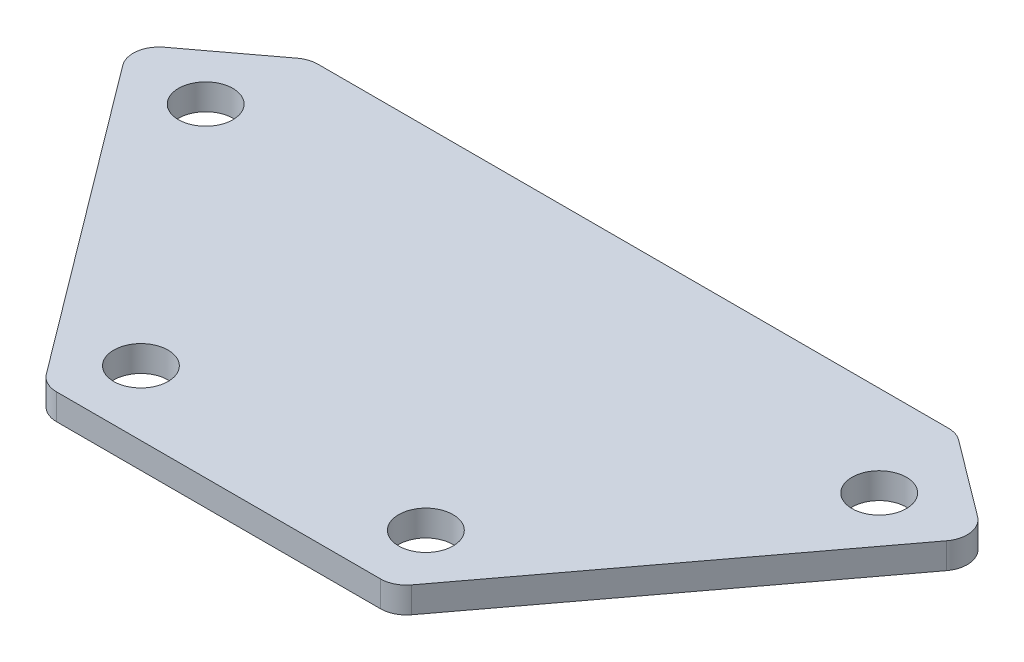
ISO-10303-21;
HEADER;
FILE_DESCRIPTION(('STEP AP214'),'2;1');
FILE_NAME('part.step','',(''),(''),'','','');
FILE_SCHEMA(('AUTOMOTIVE_DESIGN { 1 0 10303 214 1 1 1 1 }'));
ENDSEC;
DATA;
#1=APPLICATION_CONTEXT('core data for automotive mechanical design processes');
#2=APPLICATION_PROTOCOL_DEFINITION('international standard','automotive_design',2000,#1);
#3=PRODUCT_CONTEXT('',#1,'mechanical');
#4=PRODUCT('Part','Part','',(#3));
#5=PRODUCT_RELATED_PRODUCT_CATEGORY('part','',(#4));
#6=PRODUCT_DEFINITION_FORMATION('','',#4);
#7=PRODUCT_DEFINITION_CONTEXT('part definition',#1,'design');
#8=PRODUCT_DEFINITION('design','',#6,#7);
#9=PRODUCT_DEFINITION_SHAPE('','',#8);
#10=(LENGTH_UNIT() NAMED_UNIT(*) SI_UNIT(.MILLI.,.METRE.));
#11=(NAMED_UNIT(*) PLANE_ANGLE_UNIT() SI_UNIT($,.RADIAN.));
#12=(NAMED_UNIT(*) SI_UNIT($,.STERADIAN.) SOLID_ANGLE_UNIT());
#13=UNCERTAINTY_MEASURE_WITH_UNIT(LENGTH_MEASURE(1.E-05),#10,'distance_accuracy_value','');
#14=(GEOMETRIC_REPRESENTATION_CONTEXT(3) GLOBAL_UNCERTAINTY_ASSIGNED_CONTEXT((#13)) GLOBAL_UNIT_ASSIGNED_CONTEXT((#10,
#11,#12)) REPRESENTATION_CONTEXT('',''));
#15=CARTESIAN_POINT('',(0.,0.,0.));
#16=DIRECTION('',(0.,0.,1.));
#17=DIRECTION('',(1.,0.,0.));
#18=AXIS2_PLACEMENT_3D('',#15,#16,#17);
#19=CARTESIAN_POINT('',(-4.,2.,3.));
#20=DIRECTION('',(0.8,0.,-0.6));
#21=DIRECTION('',(-0.6,0.,-0.8));
#22=AXIS2_PLACEMENT_3D('',#19,#20,#21);
#23=PLANE('',#22);
#24=DIRECTION('',(0.6,0.,0.8));
#25=VECTOR('',#24,1.);
#26=CARTESIAN_POINT('',(-4.,2.,3.));
#27=LINE('',#26,#25);
#28=CARTESIAN_POINT('',(-20.8,2.,-19.4));
#29=VERTEX_POINT('',#28);
#30=CARTESIAN_POINT('',(-3.1,2.,4.2));
#31=VERTEX_POINT('',#30);
#32=EDGE_CURVE('E149',#29,#31,#27,.T.);
#33=ORIENTED_EDGE('',*,*,#32,.F.);
#34=DIRECTION('',(0.,-1.,0.));
#35=VECTOR('',#34,1.);
#36=CARTESIAN_POINT('',(-20.8,2.,-19.4));
#37=LINE('',#36,#35);
#38=CARTESIAN_POINT('',(-20.8,0.,-19.4));
#39=VERTEX_POINT('',#38);
#40=EDGE_CURVE('E134',#29,#39,#37,.T.);
#41=ORIENTED_EDGE('',*,*,#40,.T.);
#42=DIRECTION('',(0.6,0.,0.8));
#43=VECTOR('',#42,1.);
#44=CARTESIAN_POINT('',(-4.,0.,3.));
#45=LINE('',#44,#43);
#46=CARTESIAN_POINT('',(-3.1,0.,4.2));
#47=VERTEX_POINT('',#46);
#48=EDGE_CURVE('E146',#39,#47,#45,.T.);
#49=ORIENTED_EDGE('',*,*,#48,.T.);
#50=DIRECTION('',(0.,-1.,0.));
#51=VECTOR('',#50,1.);
#52=CARTESIAN_POINT('',(-3.1,2.,4.2));
#53=LINE('',#52,#51);
#54=EDGE_CURVE('E151',#47,#31,#53,.F.);
#55=ORIENTED_EDGE('',*,*,#54,.T.);
#56=EDGE_LOOP('',(#33,#41,#49,#55));
#57=FACE_BOUND('',#56,.T.);
#58=ADVANCED_FACE('F40',(#57),#23,.F.);
#59=CARTESIAN_POINT('',(0.,2.,5.));
#60=DIRECTION('',(0.,0.,1.));
#61=DIRECTION('',(1.,0.,0.));
#62=AXIS2_PLACEMENT_3D('',#59,#60,#61);
#63=PLANE('',#62);
#64=DIRECTION('',(-1.,0.,0.));
#65=VECTOR('',#64,1.);
#66=CARTESIAN_POINT('',(0.,0.,5.));
#67=LINE('',#66,#65);
#68=CARTESIAN_POINT('',(23.5,0.,5.));
#69=VERTEX_POINT('',#68);
#70=CARTESIAN_POINT('',(-1.5,0.,5.));
#71=VERTEX_POINT('',#70);
#72=EDGE_CURVE('E156',#69,#71,#67,.T.);
#73=ORIENTED_EDGE('',*,*,#72,.F.);
#74=DIRECTION('',(0.,-1.,0.));
#75=VECTOR('',#74,1.);
#76=CARTESIAN_POINT('',(23.5,2.,5.));
#77=LINE('',#76,#75);
#78=CARTESIAN_POINT('',(23.5,2.,5.));
#79=VERTEX_POINT('',#78);
#80=EDGE_CURVE('E12',#69,#79,#77,.F.);
#81=ORIENTED_EDGE('',*,*,#80,.T.);
#82=DIRECTION('',(-1.,0.,0.));
#83=VECTOR('',#82,1.);
#84=CARTESIAN_POINT('',(0.,2.,5.));
#85=LINE('',#84,#83);
#86=CARTESIAN_POINT('',(-1.5,2.,5.));
#87=VERTEX_POINT('',#86);
#88=EDGE_CURVE('E210',#79,#87,#85,.T.);
#89=ORIENTED_EDGE('',*,*,#88,.T.);
#90=DIRECTION('',(0.,-1.,0.));
#91=VECTOR('',#90,1.);
#92=CARTESIAN_POINT('',(-1.5,0.,5.));
#93=LINE('',#92,#91);
#94=EDGE_CURVE('E48',#87,#71,#93,.T.);
#95=ORIENTED_EDGE('',*,*,#94,.T.);
#96=EDGE_LOOP('',(#73,#81,#89,#95));
#97=FACE_BOUND('',#96,.T.);
#98=ADVANCED_FACE('F265',(#97),#63,.T.);
#99=CARTESIAN_POINT('',(18.08,2.,13.56));
#100=DIRECTION('',(0.8,0.,0.6));
#101=DIRECTION('',(0.6,0.,-0.8));
#102=AXIS2_PLACEMENT_3D('',#99,#100,#101);
#103=PLANE('',#102);
#104=DIRECTION('',(-0.6,0.,0.8));
#105=VECTOR('',#104,1.);
#106=CARTESIAN_POINT('',(18.08,0.,13.56));
#107=LINE('',#106,#105);
#108=CARTESIAN_POINT('',(42.8,0.,-19.4));
#109=VERTEX_POINT('',#108);
#110=CARTESIAN_POINT('',(25.1,0.,4.2));
#111=VERTEX_POINT('',#110);
#112=EDGE_CURVE('E158',#109,#111,#107,.T.);
#113=ORIENTED_EDGE('',*,*,#112,.F.);
#114=DIRECTION('',(0.,-1.,0.));
#115=VECTOR('',#114,1.);
#116=CARTESIAN_POINT('',(42.8,2.,-19.4));
#117=LINE('',#116,#115);
#118=CARTESIAN_POINT('',(42.8,2.,-19.4));
#119=VERTEX_POINT('',#118);
#120=EDGE_CURVE('E260',#109,#119,#117,.F.);
#121=ORIENTED_EDGE('',*,*,#120,.T.);
#122=DIRECTION('',(-0.6,0.,0.8));
#123=VECTOR('',#122,1.);
#124=CARTESIAN_POINT('',(18.08,2.,13.56));
#125=LINE('',#124,#123);
#126=CARTESIAN_POINT('',(25.1,2.,4.2));
#127=VERTEX_POINT('',#126);
#128=EDGE_CURVE('E214',#119,#127,#125,.T.);
#129=ORIENTED_EDGE('',*,*,#128,.T.);
#130=DIRECTION('',(0.,-1.,0.));
#131=VECTOR('',#130,1.);
#132=CARTESIAN_POINT('',(25.1,2.,4.2));
#133=LINE('',#132,#131);
#134=EDGE_CURVE('E257',#127,#111,#133,.T.);
#135=ORIENTED_EDGE('',*,*,#134,.T.);
#136=EDGE_LOOP('',(#113,#121,#129,#135));
#137=FACE_BOUND('',#136,.T.);
#138=ADVANCED_FACE('F276',(#137),#103,.T.);
#139=CARTESIAN_POINT('',(25.92,2.,-34.56));
#140=DIRECTION('',(0.6,0.,-0.8));
#141=DIRECTION('',(-0.8,0.,-0.6));
#142=AXIS2_PLACEMENT_3D('',#139,#140,#141);
#143=PLANE('',#142);
#144=DIRECTION('',(0.8,0.,0.6));
#145=VECTOR('',#144,1.);
#146=CARTESIAN_POINT('',(25.92,0.,-34.56));
#147=LINE('',#146,#145);
#148=CARTESIAN_POINT('',(36.5333333333333,0.,-26.6));
#149=VERTEX_POINT('',#148);
#150=CARTESIAN_POINT('',(42.4,0.,-22.2));
#151=VERTEX_POINT('',#150);
#152=EDGE_CURVE('E165',#149,#151,#147,.T.);
#153=ORIENTED_EDGE('',*,*,#152,.F.);
#154=DIRECTION('',(0.,-1.,0.));
#155=VECTOR('',#154,1.);
#156=CARTESIAN_POINT('',(36.5333333333333,2.,-26.6));
#157=LINE('',#156,#155);
#158=CARTESIAN_POINT('',(36.5333333333333,2.,-26.6));
#159=VERTEX_POINT('',#158);
#160=EDGE_CURVE('E255',#149,#159,#157,.F.);
#161=ORIENTED_EDGE('',*,*,#160,.T.);
#162=DIRECTION('',(0.8,0.,0.6));
#163=VECTOR('',#162,1.);
#164=CARTESIAN_POINT('',(25.92,2.,-34.56));
#165=LINE('',#164,#163);
#166=CARTESIAN_POINT('',(42.4,2.,-22.2));
#167=VERTEX_POINT('',#166);
#168=EDGE_CURVE('E219',#159,#167,#165,.T.);
#169=ORIENTED_EDGE('',*,*,#168,.T.);
#170=DIRECTION('',(0.,-1.,0.));
#171=VECTOR('',#170,1.);
#172=CARTESIAN_POINT('',(42.4,2.,-22.2));
#173=LINE('',#172,#171);
#174=EDGE_CURVE('E252',#167,#151,#173,.T.);
#175=ORIENTED_EDGE('',*,*,#174,.T.);
#176=EDGE_LOOP('',(#153,#161,#169,#175));
#177=FACE_BOUND('',#176,.T.);
#178=ADVANCED_FACE('F288',(#177),#143,.T.);
#179=CARTESIAN_POINT('',(0.,2.,-27.));
#180=DIRECTION('',(0.,0.,1.));
#181=DIRECTION('',(1.,0.,0.));
#182=AXIS2_PLACEMENT_3D('',#179,#180,#181);
#183=PLANE('',#182);
#184=DIRECTION('',(-1.,0.,0.));
#185=VECTOR('',#184,1.);
#186=CARTESIAN_POINT('',(0.,0.,-27.));
#187=LINE('',#186,#185);
#188=CARTESIAN_POINT('',(35.3333333333333,0.,-27.));
#189=VERTEX_POINT('',#188);
#190=CARTESIAN_POINT('',(-13.3333333333333,0.,-27.));
#191=VERTEX_POINT('',#190);
#192=EDGE_CURVE('E168',#189,#191,#187,.T.);
#193=ORIENTED_EDGE('',*,*,#192,.T.);
#194=DIRECTION('',(0.,-1.,0.));
#195=VECTOR('',#194,1.);
#196=CARTESIAN_POINT('',(-13.3333333333333,2.,-27.));
#197=LINE('',#196,#195);
#198=CARTESIAN_POINT('',(-13.3333333333333,2.,-27.));
#199=VERTEX_POINT('',#198);
#200=EDGE_CURVE('E55',#191,#199,#197,.F.);
#201=ORIENTED_EDGE('',*,*,#200,.T.);
#202=DIRECTION('',(-1.,0.,0.));
#203=VECTOR('',#202,1.);
#204=CARTESIAN_POINT('',(0.,2.,-27.));
#205=LINE('',#204,#203);
#206=CARTESIAN_POINT('',(35.3333333333333,2.,-27.));
#207=VERTEX_POINT('',#206);
#208=EDGE_CURVE('E235',#207,#199,#205,.T.);
#209=ORIENTED_EDGE('',*,*,#208,.F.);
#210=DIRECTION('',(0.,-1.,0.));
#211=VECTOR('',#210,1.);
#212=CARTESIAN_POINT('',(35.3333333333333,0.,-27.));
#213=LINE('',#212,#211);
#214=EDGE_CURVE('E248',#207,#189,#213,.T.);
#215=ORIENTED_EDGE('',*,*,#214,.T.);
#216=EDGE_LOOP('',(#193,#201,#209,#215));
#217=FACE_BOUND('',#216,.T.);
#218=ADVANCED_FACE('F294',(#217),#183,.F.);
#219=CARTESIAN_POINT('',(-15.,2.,-20.));
#220=DIRECTION('',(0.,-1.,0.));
#221=DIRECTION('',(0.,0.,-1.));
#222=AXIS2_PLACEMENT_3D('',#219,#220,#221);
#223=CYLINDRICAL_SURFACE('',#222,2.1);
#224=CARTESIAN_POINT('',(-15.,2.,-20.));
#225=DIRECTION('',(0.,1.,0.));
#226=DIRECTION('',(0.,0.,1.));
#227=AXIS2_PLACEMENT_3D('',#224,#225,#226);
#228=CIRCLE('',#227,2.1);
#229=CARTESIAN_POINT('',(-15.,2.,-17.9));
#230=VERTEX_POINT('',#229);
#231=EDGE_CURVE('E458',#230,#230,#228,.T.);
#232=ORIENTED_EDGE('',*,*,#231,.T.);
#233=EDGE_LOOP('',(#232));
#234=FACE_BOUND('',#233,.T.);
#235=CARTESIAN_POINT('',(-15.,0.,-20.));
#236=DIRECTION('',(0.,1.,0.));
#237=DIRECTION('',(0.,0.,1.));
#238=AXIS2_PLACEMENT_3D('',#235,#236,#237);
#239=CIRCLE('',#238,2.1);
#240=CARTESIAN_POINT('',(-15.,0.,-17.9));
#241=VERTEX_POINT('',#240);
#242=EDGE_CURVE('E178',#241,#241,#239,.T.);
#243=ORIENTED_EDGE('',*,*,#242,.F.);
#244=EDGE_LOOP('',(#243));
#245=FACE_BOUND('',#244,.T.);
#246=ADVANCED_FACE('F400',(#234,#245),#223,.F.);
#247=CARTESIAN_POINT('',(0.,2.,0.));
#248=DIRECTION('',(0.,-1.,0.));
#249=DIRECTION('',(0.,0.,-1.));
#250=AXIS2_PLACEMENT_3D('',#247,#248,#249);
#251=CYLINDRICAL_SURFACE('',#250,2.1);
#252=CARTESIAN_POINT('',(0.,2.,0.));
#253=DIRECTION('',(0.,1.,0.));
#254=DIRECTION('',(0.,0.,1.));
#255=AXIS2_PLACEMENT_3D('',#252,#253,#254);
#256=CIRCLE('',#255,2.1);
#257=CARTESIAN_POINT('',(0.,2.,2.1));
#258=VERTEX_POINT('',#257);
#259=EDGE_CURVE('E465',#258,#258,#256,.T.);
#260=ORIENTED_EDGE('',*,*,#259,.T.);
#261=EDGE_LOOP('',(#260));
#262=FACE_BOUND('',#261,.T.);
#263=CARTESIAN_POINT('',(0.,0.,0.));
#264=DIRECTION('',(0.,1.,0.));
#265=DIRECTION('',(0.,0.,1.));
#266=AXIS2_PLACEMENT_3D('',#263,#264,#265);
#267=CIRCLE('',#266,2.1);
#268=CARTESIAN_POINT('',(0.,0.,2.1));
#269=VERTEX_POINT('',#268);
#270=EDGE_CURVE('E175',#269,#269,#267,.T.);
#271=ORIENTED_EDGE('',*,*,#270,.F.);
#272=EDGE_LOOP('',(#271));
#273=FACE_BOUND('',#272,.T.);
#274=ADVANCED_FACE('F391',(#262,#273),#251,.F.);
#275=CARTESIAN_POINT('',(22.,2.,0.));
#276=DIRECTION('',(0.,-1.,0.));
#277=DIRECTION('',(0.,0.,-1.));
#278=AXIS2_PLACEMENT_3D('',#275,#276,#277);
#279=CYLINDRICAL_SURFACE('',#278,2.1);
#280=CARTESIAN_POINT('',(22.,2.,0.));
#281=DIRECTION('',(0.,1.,0.));
#282=DIRECTION('',(0.,0.,1.));
#283=AXIS2_PLACEMENT_3D('',#280,#281,#282);
#284=CIRCLE('',#283,2.1);
#285=CARTESIAN_POINT('',(22.,2.,2.1));
#286=VERTEX_POINT('',#285);
#287=EDGE_CURVE('E242',#286,#286,#284,.F.);
#288=ORIENTED_EDGE('',*,*,#287,.F.);
#289=EDGE_LOOP('',(#288));
#290=FACE_BOUND('',#289,.T.);
#291=CARTESIAN_POINT('',(22.,0.,0.));
#292=DIRECTION('',(0.,1.,0.));
#293=DIRECTION('',(0.,0.,1.));
#294=AXIS2_PLACEMENT_3D('',#291,#292,#293);
#295=CIRCLE('',#294,2.1);
#296=CARTESIAN_POINT('',(22.,0.,2.1));
#297=VERTEX_POINT('',#296);
#298=EDGE_CURVE('E172',#297,#297,#295,.F.);
#299=ORIENTED_EDGE('',*,*,#298,.T.);
#300=EDGE_LOOP('',(#299));
#301=FACE_BOUND('',#300,.T.);
#302=ADVANCED_FACE('F383',(#290,#301),#279,.F.);
#303=CARTESIAN_POINT('',(-18.,2.,-24.));
#304=DIRECTION('',(0.6,0.,0.8));
#305=DIRECTION('',(0.8,0.,-0.6));
#306=AXIS2_PLACEMENT_3D('',#303,#304,#305);
#307=PLANE('',#306);
#308=DIRECTION('',(-0.8,0.,0.6));
#309=VECTOR('',#308,1.);
#310=CARTESIAN_POINT('',(-18.,0.,-24.));
#311=LINE('',#310,#309);
#312=CARTESIAN_POINT('',(-14.5333333333333,0.,-26.6));
#313=VERTEX_POINT('',#312);
#314=CARTESIAN_POINT('',(-20.4,0.,-22.2));
#315=VERTEX_POINT('',#314);
#316=EDGE_CURVE('E170',#313,#315,#311,.T.);
#317=ORIENTED_EDGE('',*,*,#316,.T.);
#318=DIRECTION('',(0.,-1.,0.));
#319=VECTOR('',#318,1.);
#320=CARTESIAN_POINT('',(-20.4,2.,-22.2));
#321=LINE('',#320,#319);
#322=CARTESIAN_POINT('',(-20.4,2.,-22.2));
#323=VERTEX_POINT('',#322);
#324=EDGE_CURVE('E135',#315,#323,#321,.F.);
#325=ORIENTED_EDGE('',*,*,#324,.T.);
#326=DIRECTION('',(-0.8,0.,0.6));
#327=VECTOR('',#326,1.);
#328=CARTESIAN_POINT('',(-18.,2.,-24.));
#329=LINE('',#328,#327);
#330=CARTESIAN_POINT('',(-14.5333333333333,2.,-26.6));
#331=VERTEX_POINT('',#330);
#332=EDGE_CURVE('E238',#331,#323,#329,.T.);
#333=ORIENTED_EDGE('',*,*,#332,.F.);
#334=DIRECTION('',(0.,-1.,0.));
#335=VECTOR('',#334,1.);
#336=CARTESIAN_POINT('',(-14.5333333333333,2.,-26.6));
#337=LINE('',#336,#335);
#338=EDGE_CURVE('E140',#331,#313,#337,.T.);
#339=ORIENTED_EDGE('',*,*,#338,.T.);
#340=EDGE_LOOP('',(#317,#325,#333,#339));
#341=FACE_BOUND('',#340,.T.);
#342=ADVANCED_FACE('F301',(#341),#307,.F.);
#343=CARTESIAN_POINT('',(37.,2.,-20.));
#344=DIRECTION('',(0.,-1.,0.));
#345=DIRECTION('',(0.,0.,-1.));
#346=AXIS2_PLACEMENT_3D('',#343,#344,#345);
#347=CYLINDRICAL_SURFACE('',#346,2.1);
#348=CARTESIAN_POINT('',(37.,2.,-20.));
#349=DIRECTION('',(0.,1.,0.));
#350=DIRECTION('',(0.,0.,1.));
#351=AXIS2_PLACEMENT_3D('',#348,#349,#350);
#352=CIRCLE('',#351,2.1);
#353=CARTESIAN_POINT('',(37.,2.,-17.9));
#354=VERTEX_POINT('',#353);
#355=EDGE_CURVE('E161',#354,#354,#352,.F.);
#356=ORIENTED_EDGE('',*,*,#355,.F.);
#357=EDGE_LOOP('',(#356));
#358=FACE_BOUND('',#357,.T.);
#359=CARTESIAN_POINT('',(37.,0.,-20.));
#360=DIRECTION('',(0.,1.,0.));
#361=DIRECTION('',(0.,0.,1.));
#362=AXIS2_PLACEMENT_3D('',#359,#360,#361);
#363=CIRCLE('',#362,2.1);
#364=CARTESIAN_POINT('',(37.,0.,-17.9));
#365=VERTEX_POINT('',#364);
#366=EDGE_CURVE('E181',#365,#365,#363,.F.);
#367=ORIENTED_EDGE('',*,*,#366,.T.);
#368=EDGE_LOOP('',(#367));
#369=FACE_BOUND('',#368,.T.);
#370=ADVANCED_FACE('F366',(#358,#369),#347,.F.);
#371=CARTESIAN_POINT('',(0.,2.,0.));
#372=DIRECTION('',(0.,1.,0.));
#373=DIRECTION('',(0.,0.,1.));
#374=AXIS2_PLACEMENT_3D('',#371,#372,#373);
#375=PLANE('',#374);
#376=ORIENTED_EDGE('',*,*,#332,.T.);
#377=CARTESIAN_POINT('',(-19.2,2.,-20.6));
#378=DIRECTION('',(0.,1.,0.));
#379=DIRECTION('',(0.,0.,1.));
#380=AXIS2_PLACEMENT_3D('',#377,#378,#379);
#381=CIRCLE('',#380,2.);
#382=EDGE_CURVE('E245',#323,#29,#381,.T.);
#383=ORIENTED_EDGE('',*,*,#382,.T.);
#384=ORIENTED_EDGE('',*,*,#32,.T.);
#385=CARTESIAN_POINT('',(-1.5,2.,3.));
#386=DIRECTION('',(0.,1.,0.));
#387=DIRECTION('',(0.,0.,1.));
#388=AXIS2_PLACEMENT_3D('',#385,#386,#387);
#389=CIRCLE('',#388,2.);
#390=EDGE_CURVE('E196',#31,#87,#389,.T.);
#391=ORIENTED_EDGE('',*,*,#390,.T.);
#392=ORIENTED_EDGE('',*,*,#88,.F.);
#393=CARTESIAN_POINT('',(23.5,2.,3.));
#394=DIRECTION('',(0.,1.,0.));
#395=DIRECTION('',(0.,0.,1.));
#396=AXIS2_PLACEMENT_3D('',#393,#394,#395);
#397=CIRCLE('',#396,2.);
#398=EDGE_CURVE('E199',#79,#127,#397,.T.);
#399=ORIENTED_EDGE('',*,*,#398,.T.);
#400=ORIENTED_EDGE('',*,*,#128,.F.);
#401=CARTESIAN_POINT('',(41.2,2.,-20.6));
#402=DIRECTION('',(0.,1.,0.));
#403=DIRECTION('',(0.,0.,1.));
#404=AXIS2_PLACEMENT_3D('',#401,#402,#403);
#405=CIRCLE('',#404,2.);
#406=EDGE_CURVE('E225',#119,#167,#405,.T.);
#407=ORIENTED_EDGE('',*,*,#406,.T.);
#408=ORIENTED_EDGE('',*,*,#168,.F.);
#409=CARTESIAN_POINT('',(35.3333333333333,2.,-25.));
#410=DIRECTION('',(0.,1.,0.));
#411=DIRECTION('',(0.,0.,1.));
#412=AXIS2_PLACEMENT_3D('',#409,#410,#411);
#413=CIRCLE('',#412,2.);
#414=EDGE_CURVE('E62',#159,#207,#413,.T.);
#415=ORIENTED_EDGE('',*,*,#414,.T.);
#416=ORIENTED_EDGE('',*,*,#208,.T.);
#417=CARTESIAN_POINT('',(-13.3333333333333,2.,-25.));
#418=DIRECTION('',(0.,1.,0.));
#419=DIRECTION('',(0.,0.,1.));
#420=AXIS2_PLACEMENT_3D('',#417,#418,#419);
#421=CIRCLE('',#420,2.);
#422=EDGE_CURVE('E230',#199,#331,#421,.T.);
#423=ORIENTED_EDGE('',*,*,#422,.T.);
#424=EDGE_LOOP('',(#376,#383,#384,#391,#392,#399,#400,#407,#408,#415,#416,#423));
#425=FACE_BOUND('',#424,.T.);
#426=ORIENTED_EDGE('',*,*,#287,.T.);
#427=EDGE_LOOP('',(#426));
#428=FACE_BOUND('',#427,.T.);
#429=ORIENTED_EDGE('',*,*,#259,.F.);
#430=EDGE_LOOP('',(#429));
#431=FACE_BOUND('',#430,.T.);
#432=ORIENTED_EDGE('',*,*,#231,.F.);
#433=EDGE_LOOP('',(#432));
#434=FACE_BOUND('',#433,.T.);
#435=ORIENTED_EDGE('',*,*,#355,.T.);
#436=EDGE_LOOP('',(#435));
#437=FACE_BOUND('',#436,.T.);
#438=ADVANCED_FACE('F280',(#425,#428,#431,#434,#437),#375,.T.);
#439=CARTESIAN_POINT('',(0.,0.,0.));
#440=DIRECTION('',(0.,1.,0.));
#441=DIRECTION('',(0.,0.,1.));
#442=AXIS2_PLACEMENT_3D('',#439,#440,#441);
#443=PLANE('',#442);
#444=ORIENTED_EDGE('',*,*,#48,.F.);
#445=CARTESIAN_POINT('',(-19.2,0.,-20.6));
#446=DIRECTION('',(0.,1.,0.));
#447=DIRECTION('',(0.,0.,1.));
#448=AXIS2_PLACEMENT_3D('',#445,#446,#447);
#449=CIRCLE('',#448,2.);
#450=EDGE_CURVE('E130',#39,#315,#449,.F.);
#451=ORIENTED_EDGE('',*,*,#450,.T.);
#452=ORIENTED_EDGE('',*,*,#316,.F.);
#453=CARTESIAN_POINT('',(-13.3333333333333,0.,-25.));
#454=DIRECTION('',(0.,1.,0.));
#455=DIRECTION('',(0.,0.,1.));
#456=AXIS2_PLACEMENT_3D('',#453,#454,#455);
#457=CIRCLE('',#456,2.);
#458=EDGE_CURVE('E141',#313,#191,#457,.F.);
#459=ORIENTED_EDGE('',*,*,#458,.T.);
#460=ORIENTED_EDGE('',*,*,#192,.F.);
#461=CARTESIAN_POINT('',(35.3333333333333,0.,-25.));
#462=DIRECTION('',(0.,1.,0.));
#463=DIRECTION('',(0.,0.,1.));
#464=AXIS2_PLACEMENT_3D('',#461,#462,#463);
#465=CIRCLE('',#464,2.);
#466=EDGE_CURVE('E190',#189,#149,#465,.F.);
#467=ORIENTED_EDGE('',*,*,#466,.T.);
#468=ORIENTED_EDGE('',*,*,#152,.T.);
#469=CARTESIAN_POINT('',(41.2,0.,-20.6));
#470=DIRECTION('',(0.,1.,0.));
#471=DIRECTION('',(0.,0.,1.));
#472=AXIS2_PLACEMENT_3D('',#469,#470,#471);
#473=CIRCLE('',#472,2.);
#474=EDGE_CURVE('E188',#151,#109,#473,.F.);
#475=ORIENTED_EDGE('',*,*,#474,.T.);
#476=ORIENTED_EDGE('',*,*,#112,.T.);
#477=CARTESIAN_POINT('',(23.5,0.,3.));
#478=DIRECTION('',(0.,1.,0.));
#479=DIRECTION('',(0.,0.,1.));
#480=AXIS2_PLACEMENT_3D('',#477,#478,#479);
#481=CIRCLE('',#480,2.);
#482=EDGE_CURVE('E186',#111,#69,#481,.F.);
#483=ORIENTED_EDGE('',*,*,#482,.T.);
#484=ORIENTED_EDGE('',*,*,#72,.T.);
#485=CARTESIAN_POINT('',(-1.5,0.,3.));
#486=DIRECTION('',(0.,1.,0.));
#487=DIRECTION('',(0.,0.,1.));
#488=AXIS2_PLACEMENT_3D('',#485,#486,#487);
#489=CIRCLE('',#488,2.);
#490=EDGE_CURVE('E150',#71,#47,#489,.F.);
#491=ORIENTED_EDGE('',*,*,#490,.T.);
#492=EDGE_LOOP('',(#444,#451,#452,#459,#460,#467,#468,#475,#476,#483,#484,#491));
#493=FACE_BOUND('',#492,.T.);
#494=ORIENTED_EDGE('',*,*,#298,.F.);
#495=EDGE_LOOP('',(#494));
#496=FACE_BOUND('',#495,.T.);
#497=ORIENTED_EDGE('',*,*,#270,.T.);
#498=EDGE_LOOP('',(#497));
#499=FACE_BOUND('',#498,.T.);
#500=ORIENTED_EDGE('',*,*,#242,.T.);
#501=EDGE_LOOP('',(#500));
#502=FACE_BOUND('',#501,.T.);
#503=ORIENTED_EDGE('',*,*,#366,.F.);
#504=EDGE_LOOP('',(#503));
#505=FACE_BOUND('',#504,.T.);
#506=ADVANCED_FACE('F153',(#493,#496,#499,#502,#505),#443,.F.);
#507=CARTESIAN_POINT('',(-19.2,2.,-20.6));
#508=DIRECTION('',(0.,-1.,0.));
#509=DIRECTION('',(0.,0.,-1.));
#510=AXIS2_PLACEMENT_3D('',#507,#508,#509);
#511=CYLINDRICAL_SURFACE('',#510,2.);
#512=ORIENTED_EDGE('',*,*,#382,.F.);
#513=ORIENTED_EDGE('',*,*,#324,.F.);
#514=ORIENTED_EDGE('',*,*,#450,.F.);
#515=ORIENTED_EDGE('',*,*,#40,.F.);
#516=EDGE_LOOP('',(#512,#513,#514,#515));
#517=FACE_BOUND('',#516,.T.);
#518=ADVANCED_FACE('F133',(#517),#511,.T.);
#519=CARTESIAN_POINT('',(-13.3333333333333,2.,-25.));
#520=DIRECTION('',(0.,-1.,0.));
#521=DIRECTION('',(0.,0.,-1.));
#522=AXIS2_PLACEMENT_3D('',#519,#520,#521);
#523=CYLINDRICAL_SURFACE('',#522,2.);
#524=ORIENTED_EDGE('',*,*,#422,.F.);
#525=ORIENTED_EDGE('',*,*,#200,.F.);
#526=ORIENTED_EDGE('',*,*,#458,.F.);
#527=ORIENTED_EDGE('',*,*,#338,.F.);
#528=EDGE_LOOP('',(#524,#525,#526,#527));
#529=FACE_BOUND('',#528,.T.);
#530=ADVANCED_FACE('F299',(#529),#523,.T.);
#531=CARTESIAN_POINT('',(35.3333333333333,2.,-25.));
#532=DIRECTION('',(0.,1.,0.));
#533=DIRECTION('',(0.,0.,1.));
#534=AXIS2_PLACEMENT_3D('',#531,#532,#533);
#535=CYLINDRICAL_SURFACE('',#534,2.);
#536=ORIENTED_EDGE('',*,*,#414,.F.);
#537=ORIENTED_EDGE('',*,*,#160,.F.);
#538=ORIENTED_EDGE('',*,*,#466,.F.);
#539=ORIENTED_EDGE('',*,*,#214,.F.);
#540=EDGE_LOOP('',(#536,#537,#538,#539));
#541=FACE_BOUND('',#540,.T.);
#542=ADVANCED_FACE('F293',(#541),#535,.T.);
#543=CARTESIAN_POINT('',(41.2,2.,-20.6));
#544=DIRECTION('',(0.,-1.,0.));
#545=DIRECTION('',(0.,0.,-1.));
#546=AXIS2_PLACEMENT_3D('',#543,#544,#545);
#547=CYLINDRICAL_SURFACE('',#546,2.);
#548=ORIENTED_EDGE('',*,*,#406,.F.);
#549=ORIENTED_EDGE('',*,*,#120,.F.);
#550=ORIENTED_EDGE('',*,*,#474,.F.);
#551=ORIENTED_EDGE('',*,*,#174,.F.);
#552=EDGE_LOOP('',(#548,#549,#550,#551));
#553=FACE_BOUND('',#552,.T.);
#554=ADVANCED_FACE('F285',(#553),#547,.T.);
#555=CARTESIAN_POINT('',(23.5,2.,3.));
#556=DIRECTION('',(0.,-1.,0.));
#557=DIRECTION('',(0.,0.,-1.));
#558=AXIS2_PLACEMENT_3D('',#555,#556,#557);
#559=CYLINDRICAL_SURFACE('',#558,2.);
#560=ORIENTED_EDGE('',*,*,#398,.F.);
#561=ORIENTED_EDGE('',*,*,#80,.F.);
#562=ORIENTED_EDGE('',*,*,#482,.F.);
#563=ORIENTED_EDGE('',*,*,#134,.F.);
#564=EDGE_LOOP('',(#560,#561,#562,#563));
#565=FACE_BOUND('',#564,.T.);
#566=ADVANCED_FACE('F274',(#565),#559,.T.);
#567=CARTESIAN_POINT('',(-1.5,2.,3.));
#568=DIRECTION('',(0.,1.,0.));
#569=DIRECTION('',(0.,0.,1.));
#570=AXIS2_PLACEMENT_3D('',#567,#568,#569);
#571=CYLINDRICAL_SURFACE('',#570,2.);
#572=ORIENTED_EDGE('',*,*,#390,.F.);
#573=ORIENTED_EDGE('',*,*,#54,.F.);
#574=ORIENTED_EDGE('',*,*,#490,.F.);
#575=ORIENTED_EDGE('',*,*,#94,.F.);
#576=EDGE_LOOP('',(#572,#573,#574,#575));
#577=FACE_BOUND('',#576,.T.);
#578=ADVANCED_FACE('F42',(#577),#571,.T.);
#579=CLOSED_SHELL('',(#58,#98,#138,#178,#218,#246,#274,#302,#342,#370,#438,#506,#518,#530,#542,
#554,#566,#578));
#580=MANIFOLD_SOLID_BREP('B2',#579);
#581=ADVANCED_BREP_SHAPE_REPRESENTATION('',(#18,#580),#14);
#582=SHAPE_DEFINITION_REPRESENTATION(#9,#581);
ENDSEC;
END-ISO-10303-21;
